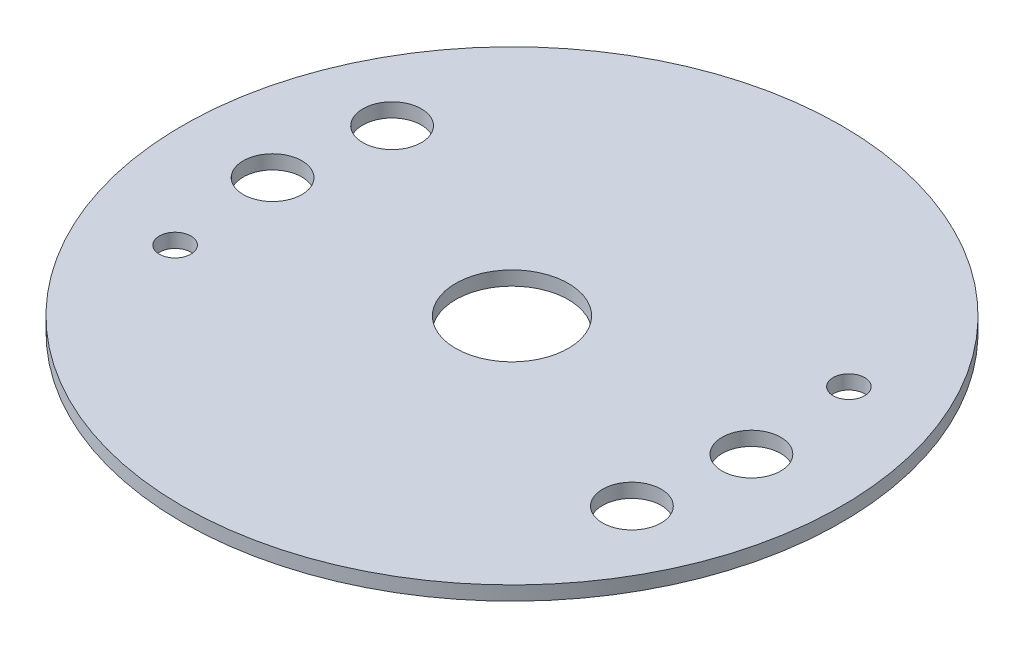
ISO-10303-21;
HEADER;
FILE_DESCRIPTION(('STEP AP214'),'2;1');
FILE_NAME('part.step','',(''),(''),'','','');
FILE_SCHEMA(('AUTOMOTIVE_DESIGN { 1 0 10303 214 1 1 1 1 }'));
ENDSEC;
DATA;
#1=APPLICATION_CONTEXT('core data for automotive mechanical design processes');
#2=APPLICATION_PROTOCOL_DEFINITION('international standard','automotive_design',2000,#1);
#3=PRODUCT_CONTEXT('',#1,'mechanical');
#4=PRODUCT('Part','Part','',(#3));
#5=PRODUCT_RELATED_PRODUCT_CATEGORY('part','',(#4));
#6=PRODUCT_DEFINITION_FORMATION('','',#4);
#7=PRODUCT_DEFINITION_CONTEXT('part definition',#1,'design');
#8=PRODUCT_DEFINITION('design','',#6,#7);
#9=PRODUCT_DEFINITION_SHAPE('','',#8);
#10=(LENGTH_UNIT() NAMED_UNIT(*) SI_UNIT(.MILLI.,.METRE.));
#11=(NAMED_UNIT(*) PLANE_ANGLE_UNIT() SI_UNIT($,.RADIAN.));
#12=(NAMED_UNIT(*) SI_UNIT($,.STERADIAN.) SOLID_ANGLE_UNIT());
#13=UNCERTAINTY_MEASURE_WITH_UNIT(LENGTH_MEASURE(1.E-05),#10,'distance_accuracy_value','');
#14=(GEOMETRIC_REPRESENTATION_CONTEXT(3) GLOBAL_UNCERTAINTY_ASSIGNED_CONTEXT((#13)) GLOBAL_UNIT_ASSIGNED_CONTEXT((#10,
#11,#12)) REPRESENTATION_CONTEXT('',''));
#15=CARTESIAN_POINT('',(0.,0.,0.));
#16=DIRECTION('',(0.,0.,1.));
#17=DIRECTION('',(1.,0.,0.));
#18=AXIS2_PLACEMENT_3D('',#15,#16,#17);
#19=CARTESIAN_POINT('',(0.,3.175,0.));
#20=DIRECTION('',(0.,1.,0.));
#21=DIRECTION('',(0.,0.,1.));
#22=AXIS2_PLACEMENT_3D('',#19,#20,#21);
#23=PLANE('',#22);
#24=CARTESIAN_POINT('',(50.644479139608,3.175,23.6159084660704));
#25=DIRECTION('',(0.,1.,0.));
#26=DIRECTION('',(0.,0.,1.));
#27=AXIS2_PLACEMENT_3D('',#24,#25,#26);
#28=CIRCLE('',#27,6.604);
#29=CARTESIAN_POINT('',(50.644479139608,3.175,30.2199084660704));
#30=VERTEX_POINT('',#29);
#31=EDGE_CURVE('E78',#30,#30,#28,.T.);
#32=ORIENTED_EDGE('',*,*,#31,.F.);
#33=EDGE_LOOP('',(#32));
#34=FACE_BOUND('',#33,.T.);
#35=CARTESIAN_POINT('',(51.7954900291445,3.175,-24.152633658481));
#36=DIRECTION('',(0.,1.,0.));
#37=DIRECTION('',(0.,0.,1.));
#38=AXIS2_PLACEMENT_3D('',#35,#36,#37);
#39=CIRCLE('',#38,3.55600000000001);
#40=CARTESIAN_POINT('',(51.7954900291445,3.175,-20.596633658481));
#41=VERTEX_POINT('',#40);
#42=EDGE_CURVE('E67',#41,#41,#39,.T.);
#43=ORIENTED_EDGE('',*,*,#42,.F.);
#44=EDGE_LOOP('',(#43));
#45=FACE_BOUND('',#44,.T.);
#46=CARTESIAN_POINT('',(-51.7954900291445,3.175,24.152633658481));
#47=DIRECTION('',(0.,1.,0.));
#48=DIRECTION('',(0.,0.,1.));
#49=AXIS2_PLACEMENT_3D('',#46,#47,#48);
#50=CIRCLE('',#49,3.55600000000001);
#51=CARTESIAN_POINT('',(-51.7954900291445,3.175,27.7086336584811));
#52=VERTEX_POINT('',#51);
#53=EDGE_CURVE('E66',#52,#52,#50,.T.);
#54=ORIENTED_EDGE('',*,*,#53,.F.);
#55=EDGE_LOOP('',(#54));
#56=FACE_BOUND('',#55,.T.);
#57=CARTESIAN_POINT('',(53.975,3.175,0.));
#58=DIRECTION('',(0.,1.,0.));
#59=DIRECTION('',(0.,0.,1.));
#60=AXIS2_PLACEMENT_3D('',#57,#58,#59);
#61=CIRCLE('',#60,6.604);
#62=CARTESIAN_POINT('',(53.975,3.175,6.60399999999998));
#63=VERTEX_POINT('',#62);
#64=EDGE_CURVE('E60',#63,#63,#61,.T.);
#65=ORIENTED_EDGE('',*,*,#64,.F.);
#66=EDGE_LOOP('',(#65));
#67=FACE_BOUND('',#66,.T.);
#68=CARTESIAN_POINT('',(-50.6444791396082,3.175,-23.6159084660699));
#69=DIRECTION('',(0.,1.,0.));
#70=DIRECTION('',(0.,0.,1.));
#71=AXIS2_PLACEMENT_3D('',#68,#69,#70);
#72=CIRCLE('',#71,6.604);
#73=CARTESIAN_POINT('',(-50.6444791396082,3.175,-17.01190846607));
#74=VERTEX_POINT('',#73);
#75=EDGE_CURVE('E79',#74,#74,#72,.T.);
#76=ORIENTED_EDGE('',*,*,#75,.F.);
#77=EDGE_LOOP('',(#76));
#78=FACE_BOUND('',#77,.T.);
#79=CARTESIAN_POINT('',(-53.975,3.175,0.));
#80=DIRECTION('',(0.,1.,0.));
#81=DIRECTION('',(0.,0.,1.));
#82=AXIS2_PLACEMENT_3D('',#79,#80,#81);
#83=CIRCLE('',#82,6.604);
#84=CARTESIAN_POINT('',(-53.975,3.175,6.60400000000001));
#85=VERTEX_POINT('',#84);
#86=EDGE_CURVE('E57',#85,#85,#83,.T.);
#87=ORIENTED_EDGE('',*,*,#86,.F.);
#88=EDGE_LOOP('',(#87));
#89=FACE_BOUND('',#88,.T.);
#90=CARTESIAN_POINT('',(0.,3.175,0.));
#91=DIRECTION('',(0.,1.,0.));
#92=DIRECTION('',(0.,0.,1.));
#93=AXIS2_PLACEMENT_3D('',#90,#91,#92);
#94=CIRCLE('',#93,74.295);
#95=CARTESIAN_POINT('',(0.,3.175,74.295));
#96=VERTEX_POINT('',#95);
#97=EDGE_CURVE('E10',#96,#96,#94,.T.);
#98=ORIENTED_EDGE('',*,*,#97,.T.);
#99=EDGE_LOOP('',(#98));
#100=FACE_BOUND('',#99,.T.);
#101=CARTESIAN_POINT('',(0.,3.175,0.));
#102=DIRECTION('',(0.,1.,0.));
#103=DIRECTION('',(0.,0.,1.));
#104=AXIS2_PLACEMENT_3D('',#101,#102,#103);
#105=CIRCLE('',#104,12.7);
#106=CARTESIAN_POINT('',(0.,3.175,12.7));
#107=VERTEX_POINT('',#106);
#108=EDGE_CURVE('E49',#107,#107,#105,.T.);
#109=ORIENTED_EDGE('',*,*,#108,.F.);
#110=EDGE_LOOP('',(#109));
#111=FACE_BOUND('',#110,.T.);
#112=ADVANCED_FACE('F38',(#34,#45,#56,#67,#78,#89,#100,#111),#23,.T.);
#113=CARTESIAN_POINT('',(0.,0.,0.));
#114=DIRECTION('',(0.,1.,0.));
#115=DIRECTION('',(0.,0.,1.));
#116=AXIS2_PLACEMENT_3D('',#113,#114,#115);
#117=PLANE('',#116);
#118=CARTESIAN_POINT('',(50.644479139608,0.,23.6159084660704));
#119=DIRECTION('',(0.,1.,0.));
#120=DIRECTION('',(0.,0.,1.));
#121=AXIS2_PLACEMENT_3D('',#118,#119,#120);
#122=CIRCLE('',#121,6.604);
#123=CARTESIAN_POINT('',(50.644479139608,0.,30.2199084660704));
#124=VERTEX_POINT('',#123);
#125=EDGE_CURVE('E75',#124,#124,#122,.T.);
#126=ORIENTED_EDGE('',*,*,#125,.T.);
#127=EDGE_LOOP('',(#126));
#128=FACE_BOUND('',#127,.T.);
#129=CARTESIAN_POINT('',(51.7954900291445,0.,-24.152633658481));
#130=DIRECTION('',(0.,1.,0.));
#131=DIRECTION('',(0.,0.,1.));
#132=AXIS2_PLACEMENT_3D('',#129,#130,#131);
#133=CIRCLE('',#132,3.55600000000001);
#134=CARTESIAN_POINT('',(51.7954900291445,0.,-20.596633658481));
#135=VERTEX_POINT('',#134);
#136=EDGE_CURVE('E82',#135,#135,#133,.T.);
#137=ORIENTED_EDGE('',*,*,#136,.T.);
#138=EDGE_LOOP('',(#137));
#139=FACE_BOUND('',#138,.T.);
#140=CARTESIAN_POINT('',(-51.7954900291445,0.,24.152633658481));
#141=DIRECTION('',(0.,1.,0.));
#142=DIRECTION('',(0.,0.,1.));
#143=AXIS2_PLACEMENT_3D('',#140,#141,#142);
#144=CIRCLE('',#143,3.55600000000001);
#145=CARTESIAN_POINT('',(-51.7954900291445,0.,27.7086336584811));
#146=VERTEX_POINT('',#145);
#147=EDGE_CURVE('E63',#146,#146,#144,.T.);
#148=ORIENTED_EDGE('',*,*,#147,.T.);
#149=EDGE_LOOP('',(#148));
#150=FACE_BOUND('',#149,.T.);
#151=CARTESIAN_POINT('',(53.975,0.,0.));
#152=DIRECTION('',(0.,1.,0.));
#153=DIRECTION('',(0.,0.,1.));
#154=AXIS2_PLACEMENT_3D('',#151,#152,#153);
#155=CIRCLE('',#154,6.604);
#156=CARTESIAN_POINT('',(53.975,0.,6.60399999999998));
#157=VERTEX_POINT('',#156);
#158=EDGE_CURVE('E70',#157,#157,#155,.T.);
#159=ORIENTED_EDGE('',*,*,#158,.T.);
#160=EDGE_LOOP('',(#159));
#161=FACE_BOUND('',#160,.T.);
#162=CARTESIAN_POINT('',(-50.6444791396082,0.,-23.6159084660699));
#163=DIRECTION('',(0.,1.,0.));
#164=DIRECTION('',(0.,0.,1.));
#165=AXIS2_PLACEMENT_3D('',#162,#163,#164);
#166=CIRCLE('',#165,6.604);
#167=CARTESIAN_POINT('',(-50.6444791396082,0.,-17.01190846607));
#168=VERTEX_POINT('',#167);
#169=EDGE_CURVE('E87',#168,#168,#166,.T.);
#170=ORIENTED_EDGE('',*,*,#169,.T.);
#171=EDGE_LOOP('',(#170));
#172=FACE_BOUND('',#171,.T.);
#173=CARTESIAN_POINT('',(-53.975,0.,0.));
#174=DIRECTION('',(0.,1.,0.));
#175=DIRECTION('',(0.,0.,1.));
#176=AXIS2_PLACEMENT_3D('',#173,#174,#175);
#177=CIRCLE('',#176,6.604);
#178=CARTESIAN_POINT('',(-53.975,0.,6.60400000000001));
#179=VERTEX_POINT('',#178);
#180=EDGE_CURVE('E54',#179,#179,#177,.T.);
#181=ORIENTED_EDGE('',*,*,#180,.T.);
#182=EDGE_LOOP('',(#181));
#183=FACE_BOUND('',#182,.T.);
#184=CARTESIAN_POINT('',(0.,0.,0.));
#185=DIRECTION('',(0.,1.,0.));
#186=DIRECTION('',(0.,0.,1.));
#187=AXIS2_PLACEMENT_3D('',#184,#185,#186);
#188=CIRCLE('',#187,74.295);
#189=CARTESIAN_POINT('',(0.,0.,74.295));
#190=VERTEX_POINT('',#189);
#191=EDGE_CURVE('E42',#190,#190,#188,.T.);
#192=ORIENTED_EDGE('',*,*,#191,.F.);
#193=EDGE_LOOP('',(#192));
#194=FACE_BOUND('',#193,.T.);
#195=CARTESIAN_POINT('',(0.,0.,0.));
#196=DIRECTION('',(0.,1.,0.));
#197=DIRECTION('',(0.,0.,1.));
#198=AXIS2_PLACEMENT_3D('',#195,#196,#197);
#199=CIRCLE('',#198,12.7);
#200=CARTESIAN_POINT('',(0.,0.,12.7));
#201=VERTEX_POINT('',#200);
#202=EDGE_CURVE('E51',#201,#201,#199,.T.);
#203=ORIENTED_EDGE('',*,*,#202,.T.);
#204=EDGE_LOOP('',(#203));
#205=FACE_BOUND('',#204,.T.);
#206=ADVANCED_FACE('F97',(#128,#139,#150,#161,#172,#183,#194,#205),#117,.F.);
#207=CARTESIAN_POINT('',(0.,3.175,0.));
#208=DIRECTION('',(0.,-1.,0.));
#209=DIRECTION('',(0.,0.,-1.));
#210=AXIS2_PLACEMENT_3D('',#207,#208,#209);
#211=CYLINDRICAL_SURFACE('',#210,74.295);
#212=ORIENTED_EDGE('',*,*,#97,.F.);
#213=EDGE_LOOP('',(#212));
#214=FACE_BOUND('',#213,.T.);
#215=ORIENTED_EDGE('',*,*,#191,.T.);
#216=EDGE_LOOP('',(#215));
#217=FACE_BOUND('',#216,.T.);
#218=ADVANCED_FACE('F40',(#214,#217),#211,.T.);
#219=CARTESIAN_POINT('',(0.,3.175,0.));
#220=DIRECTION('',(0.,-1.,0.));
#221=DIRECTION('',(0.,0.,-1.));
#222=AXIS2_PLACEMENT_3D('',#219,#220,#221);
#223=CYLINDRICAL_SURFACE('',#222,12.7);
#224=ORIENTED_EDGE('',*,*,#108,.T.);
#225=EDGE_LOOP('',(#224));
#226=FACE_BOUND('',#225,.T.);
#227=ORIENTED_EDGE('',*,*,#202,.F.);
#228=EDGE_LOOP('',(#227));
#229=FACE_BOUND('',#228,.T.);
#230=ADVANCED_FACE('F104',(#226,#229),#223,.F.);
#231=CARTESIAN_POINT('',(-53.975,0.,0.));
#232=DIRECTION('',(0.,1.,0.));
#233=DIRECTION('',(0.,0.,1.));
#234=AXIS2_PLACEMENT_3D('',#231,#232,#233);
#235=CYLINDRICAL_SURFACE('',#234,6.604);
#236=ORIENTED_EDGE('',*,*,#180,.F.);
#237=EDGE_LOOP('',(#236));
#238=FACE_BOUND('',#237,.T.);
#239=ORIENTED_EDGE('',*,*,#86,.T.);
#240=EDGE_LOOP('',(#239));
#241=FACE_BOUND('',#240,.T.);
#242=ADVANCED_FACE('F107',(#238,#241),#235,.F.);
#243=CARTESIAN_POINT('',(-50.6444791396082,0.,-23.6159084660699));
#244=DIRECTION('',(0.,1.,0.));
#245=DIRECTION('',(0.,0.,1.));
#246=AXIS2_PLACEMENT_3D('',#243,#244,#245);
#247=CYLINDRICAL_SURFACE('',#246,6.604);
#248=ORIENTED_EDGE('',*,*,#169,.F.);
#249=EDGE_LOOP('',(#248));
#250=FACE_BOUND('',#249,.T.);
#251=ORIENTED_EDGE('',*,*,#75,.T.);
#252=EDGE_LOOP('',(#251));
#253=FACE_BOUND('',#252,.T.);
#254=ADVANCED_FACE('F93',(#250,#253),#247,.F.);
#255=CARTESIAN_POINT('',(53.975,0.,0.));
#256=DIRECTION('',(0.,1.,0.));
#257=DIRECTION('',(0.,0.,1.));
#258=AXIS2_PLACEMENT_3D('',#255,#256,#257);
#259=CYLINDRICAL_SURFACE('',#258,6.604);
#260=ORIENTED_EDGE('',*,*,#158,.F.);
#261=EDGE_LOOP('',(#260));
#262=FACE_BOUND('',#261,.T.);
#263=ORIENTED_EDGE('',*,*,#64,.T.);
#264=EDGE_LOOP('',(#263));
#265=FACE_BOUND('',#264,.T.);
#266=ADVANCED_FACE('F126',(#262,#265),#259,.F.);
#267=CARTESIAN_POINT('',(-51.7954900291445,0.,24.152633658481));
#268=DIRECTION('',(0.,1.,0.));
#269=DIRECTION('',(0.,0.,1.));
#270=AXIS2_PLACEMENT_3D('',#267,#268,#269);
#271=CYLINDRICAL_SURFACE('',#270,3.55600000000001);
#272=ORIENTED_EDGE('',*,*,#147,.F.);
#273=EDGE_LOOP('',(#272));
#274=FACE_BOUND('',#273,.T.);
#275=ORIENTED_EDGE('',*,*,#53,.T.);
#276=EDGE_LOOP('',(#275));
#277=FACE_BOUND('',#276,.T.);
#278=ADVANCED_FACE('F122',(#274,#277),#271,.F.);
#279=CARTESIAN_POINT('',(51.7954900291445,0.,-24.152633658481));
#280=DIRECTION('',(0.,1.,0.));
#281=DIRECTION('',(0.,0.,1.));
#282=AXIS2_PLACEMENT_3D('',#279,#280,#281);
#283=CYLINDRICAL_SURFACE('',#282,3.55600000000001);
#284=ORIENTED_EDGE('',*,*,#136,.F.);
#285=EDGE_LOOP('',(#284));
#286=FACE_BOUND('',#285,.T.);
#287=ORIENTED_EDGE('',*,*,#42,.T.);
#288=EDGE_LOOP('',(#287));
#289=FACE_BOUND('',#288,.T.);
#290=ADVANCED_FACE('F125',(#286,#289),#283,.F.);
#291=CARTESIAN_POINT('',(50.644479139608,0.,23.6159084660704));
#292=DIRECTION('',(0.,1.,0.));
#293=DIRECTION('',(0.,0.,1.));
#294=AXIS2_PLACEMENT_3D('',#291,#292,#293);
#295=CYLINDRICAL_SURFACE('',#294,6.604);
#296=ORIENTED_EDGE('',*,*,#125,.F.);
#297=EDGE_LOOP('',(#296));
#298=FACE_BOUND('',#297,.T.);
#299=ORIENTED_EDGE('',*,*,#31,.T.);
#300=EDGE_LOOP('',(#299));
#301=FACE_BOUND('',#300,.T.);
#302=ADVANCED_FACE('F131',(#298,#301),#295,.F.);
#303=CLOSED_SHELL('',(#112,#206,#218,#230,#242,#254,#266,#278,#290,#302));
#304=MANIFOLD_SOLID_BREP('B2',#303);
#305=ADVANCED_BREP_SHAPE_REPRESENTATION('',(#18,#304),#14);
#306=SHAPE_DEFINITION_REPRESENTATION(#9,#305);
ENDSEC;
END-ISO-10303-21;
